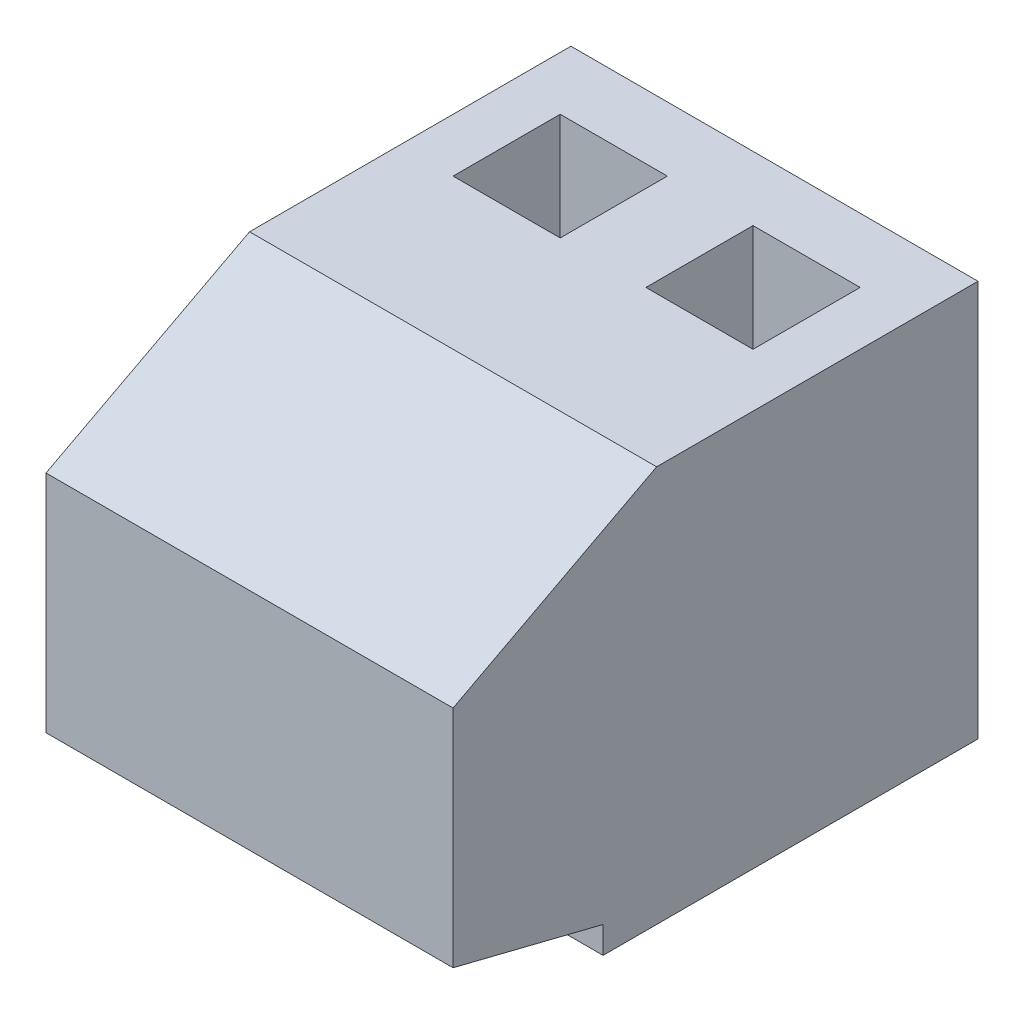
ISO-10303-21;
HEADER;
FILE_DESCRIPTION(('STEP AP214'),'2;1');
FILE_NAME('part.step','',(''),(''),'','','');
FILE_SCHEMA(('AUTOMOTIVE_DESIGN { 1 0 10303 214 1 1 1 1 }'));
ENDSEC;
DATA;
#1=APPLICATION_CONTEXT('core data for automotive mechanical design processes');
#2=APPLICATION_PROTOCOL_DEFINITION('international standard','automotive_design',2000,#1);
#3=PRODUCT_CONTEXT('',#1,'mechanical');
#4=PRODUCT('Part','Part','',(#3));
#5=PRODUCT_RELATED_PRODUCT_CATEGORY('part','',(#4));
#6=PRODUCT_DEFINITION_FORMATION('','',#4);
#7=PRODUCT_DEFINITION_CONTEXT('part definition',#1,'design');
#8=PRODUCT_DEFINITION('design','',#6,#7);
#9=PRODUCT_DEFINITION_SHAPE('','',#8);
#10=(LENGTH_UNIT() NAMED_UNIT(*) SI_UNIT(.MILLI.,.METRE.));
#11=(NAMED_UNIT(*) PLANE_ANGLE_UNIT() SI_UNIT($,.RADIAN.));
#12=(NAMED_UNIT(*) SI_UNIT($,.STERADIAN.) SOLID_ANGLE_UNIT());
#13=UNCERTAINTY_MEASURE_WITH_UNIT(LENGTH_MEASURE(1.E-05),#10,'distance_accuracy_value','');
#14=(GEOMETRIC_REPRESENTATION_CONTEXT(3) GLOBAL_UNCERTAINTY_ASSIGNED_CONTEXT((#13)) GLOBAL_UNIT_ASSIGNED_CONTEXT((#10,
#11,#12)) REPRESENTATION_CONTEXT('',''));
#15=CARTESIAN_POINT('',(0.,0.,0.));
#16=DIRECTION('',(0.,0.,1.));
#17=DIRECTION('',(1.,0.,0.));
#18=AXIS2_PLACEMENT_3D('',#15,#16,#17);
#19=CARTESIAN_POINT('',(3.8,3.7,6.));
#20=DIRECTION('',(-1.,0.,0.));
#21=DIRECTION('',(0.,-1.,0.));
#22=AXIS2_PLACEMENT_3D('',#19,#20,#21);
#23=PLANE('',#22);
#24=DIRECTION('',(0.,1.,0.));
#25=VECTOR('',#24,1.);
#26=CARTESIAN_POINT('',(3.8,3.7,0.));
#27=LINE('',#26,#25);
#28=CARTESIAN_POINT('',(3.8,-3.7,0.));
#29=VERTEX_POINT('',#28);
#30=CARTESIAN_POINT('',(3.8,3.7,0.));
#31=VERTEX_POINT('',#30);
#32=EDGE_CURVE('E237',#29,#31,#27,.T.);
#33=ORIENTED_EDGE('',*,*,#32,.T.);
#34=DIRECTION('',(0.,0.,-1.));
#35=VECTOR('',#34,1.);
#36=CARTESIAN_POINT('',(3.8,3.7,6.));
#37=LINE('',#36,#35);
#38=CARTESIAN_POINT('',(3.8,3.7,6.));
#39=VERTEX_POINT('',#38);
#40=EDGE_CURVE('E11',#39,#31,#37,.T.);
#41=ORIENTED_EDGE('',*,*,#40,.F.);
#42=DIRECTION('',(0.,-0.465746432832622,0.884918222381982));
#43=VECTOR('',#42,1.);
#44=CARTESIAN_POINT('',(3.8,1.7,9.8));
#45=LINE('',#44,#43);
#46=CARTESIAN_POINT('',(3.8,1.7,9.8));
#47=VERTEX_POINT('',#46);
#48=EDGE_CURVE('E202',#39,#47,#45,.T.);
#49=ORIENTED_EDGE('',*,*,#48,.T.);
#50=DIRECTION('',(0.,-1.,0.));
#51=VECTOR('',#50,1.);
#52=CARTESIAN_POINT('',(3.8,-2.5,9.8));
#53=LINE('',#52,#51);
#54=CARTESIAN_POINT('',(3.8,-2.5,9.8));
#55=VERTEX_POINT('',#54);
#56=EDGE_CURVE('E219',#47,#55,#53,.T.);
#57=ORIENTED_EDGE('',*,*,#56,.T.);
#58=DIRECTION('',(0.,-0.242535625036333,-0.970142500145332));
#59=VECTOR('',#58,1.);
#60=CARTESIAN_POINT('',(3.8,-3.2,7.));
#61=LINE('',#60,#59);
#62=CARTESIAN_POINT('',(3.8,-3.2,7.));
#63=VERTEX_POINT('',#62);
#64=EDGE_CURVE('E222',#55,#63,#61,.T.);
#65=ORIENTED_EDGE('',*,*,#64,.T.);
#66=DIRECTION('',(0.,-1.,0.));
#67=VECTOR('',#66,1.);
#68=CARTESIAN_POINT('',(3.8,-3.7,7.));
#69=LINE('',#68,#67);
#70=CARTESIAN_POINT('',(3.8,-3.7,7.));
#71=VERTEX_POINT('',#70);
#72=EDGE_CURVE('E225',#63,#71,#69,.T.);
#73=ORIENTED_EDGE('',*,*,#72,.T.);
#74=DIRECTION('',(0.,0.,-1.));
#75=VECTOR('',#74,1.);
#76=CARTESIAN_POINT('',(3.8,-3.7,6.));
#77=LINE('',#76,#75);
#78=EDGE_CURVE('E241',#71,#29,#77,.T.);
#79=ORIENTED_EDGE('',*,*,#78,.T.);
#80=EDGE_LOOP('',(#33,#41,#49,#57,#65,#73,#79));
#81=FACE_BOUND('',#80,.T.);
#82=ADVANCED_FACE('F33',(#81),#23,.F.);
#83=CARTESIAN_POINT('',(-3.8,3.7,6.));
#84=DIRECTION('',(0.,-1.,0.));
#85=DIRECTION('',(0.,0.,-1.));
#86=AXIS2_PLACEMENT_3D('',#83,#84,#85);
#87=PLANE('',#86);
#88=DIRECTION('',(-1.,0.,0.));
#89=VECTOR('',#88,1.);
#90=CARTESIAN_POINT('',(2.8,3.7,1.2));
#91=LINE('',#90,#89);
#92=CARTESIAN_POINT('',(2.8,3.7,1.2));
#93=VERTEX_POINT('',#92);
#94=CARTESIAN_POINT('',(0.8,3.7,1.2));
#95=VERTEX_POINT('',#94);
#96=EDGE_CURVE('E168',#93,#95,#91,.T.);
#97=ORIENTED_EDGE('',*,*,#96,.F.);
#98=DIRECTION('',(0.,0.,-1.));
#99=VECTOR('',#98,1.);
#100=CARTESIAN_POINT('',(2.8,3.7,1.2));
#101=LINE('',#100,#99);
#102=CARTESIAN_POINT('',(2.8,3.7,3.2));
#103=VERTEX_POINT('',#102);
#104=EDGE_CURVE('E47',#103,#93,#101,.T.);
#105=ORIENTED_EDGE('',*,*,#104,.F.);
#106=DIRECTION('',(1.,0.,0.));
#107=VECTOR('',#106,1.);
#108=CARTESIAN_POINT('',(2.8,3.7,3.2));
#109=LINE('',#108,#107);
#110=CARTESIAN_POINT('',(0.8,3.7,3.2));
#111=VERTEX_POINT('',#110);
#112=EDGE_CURVE('E159',#111,#103,#109,.T.);
#113=ORIENTED_EDGE('',*,*,#112,.F.);
#114=DIRECTION('',(0.,0.,1.));
#115=VECTOR('',#114,1.);
#116=CARTESIAN_POINT('',(0.8,3.7,1.2));
#117=LINE('',#116,#115);
#118=EDGE_CURVE('E162',#95,#111,#117,.T.);
#119=ORIENTED_EDGE('',*,*,#118,.F.);
#120=EDGE_LOOP('',(#97,#105,#113,#119));
#121=FACE_BOUND('',#120,.T.);
#122=DIRECTION('',(-1.,0.,0.));
#123=VECTOR('',#122,1.);
#124=CARTESIAN_POINT('',(-2.8,3.7,1.2));
#125=LINE('',#124,#123);
#126=CARTESIAN_POINT('',(-0.799999999999999,3.7,1.2));
#127=VERTEX_POINT('',#126);
#128=CARTESIAN_POINT('',(-2.8,3.7,1.2));
#129=VERTEX_POINT('',#128);
#130=EDGE_CURVE('E192',#127,#129,#125,.T.);
#131=ORIENTED_EDGE('',*,*,#130,.F.);
#132=DIRECTION('',(0.,0.,-1.));
#133=VECTOR('',#132,1.);
#134=CARTESIAN_POINT('',(-0.799999999999999,3.7,1.2));
#135=LINE('',#134,#133);
#136=CARTESIAN_POINT('',(-0.799999999999999,3.7,3.2));
#137=VERTEX_POINT('',#136);
#138=EDGE_CURVE('E55',#137,#127,#135,.T.);
#139=ORIENTED_EDGE('',*,*,#138,.F.);
#140=DIRECTION('',(1.,0.,0.));
#141=VECTOR('',#140,1.);
#142=CARTESIAN_POINT('',(-2.8,3.7,3.2));
#143=LINE('',#142,#141);
#144=CARTESIAN_POINT('',(-2.8,3.7,3.2));
#145=VERTEX_POINT('',#144);
#146=EDGE_CURVE('E181',#145,#137,#143,.T.);
#147=ORIENTED_EDGE('',*,*,#146,.F.);
#148=DIRECTION('',(0.,0.,1.));
#149=VECTOR('',#148,1.);
#150=CARTESIAN_POINT('',(-2.8,3.7,1.2));
#151=LINE('',#150,#149);
#152=EDGE_CURVE('E195',#129,#145,#151,.T.);
#153=ORIENTED_EDGE('',*,*,#152,.F.);
#154=EDGE_LOOP('',(#131,#139,#147,#153));
#155=FACE_BOUND('',#154,.T.);
#156=DIRECTION('',(-1.,0.,0.));
#157=VECTOR('',#156,1.);
#158=CARTESIAN_POINT('',(-3.8,3.7,0.));
#159=LINE('',#158,#157);
#160=CARTESIAN_POINT('',(-3.8,3.7,0.));
#161=VERTEX_POINT('',#160);
#162=EDGE_CURVE('E245',#31,#161,#159,.T.);
#163=ORIENTED_EDGE('',*,*,#162,.T.);
#164=DIRECTION('',(0.,0.,-1.));
#165=VECTOR('',#164,1.);
#166=CARTESIAN_POINT('',(-3.8,3.7,6.));
#167=LINE('',#166,#165);
#168=CARTESIAN_POINT('',(-3.8,3.7,6.));
#169=VERTEX_POINT('',#168);
#170=EDGE_CURVE('E40',#169,#161,#167,.T.);
#171=ORIENTED_EDGE('',*,*,#170,.F.);
#172=DIRECTION('',(-1.,0.,0.));
#173=VECTOR('',#172,1.);
#174=CARTESIAN_POINT('',(-3.8,3.7,6.));
#175=LINE('',#174,#173);
#176=EDGE_CURVE('E238',#39,#169,#175,.T.);
#177=ORIENTED_EDGE('',*,*,#176,.F.);
#178=ORIENTED_EDGE('',*,*,#40,.T.);
#179=EDGE_LOOP('',(#163,#171,#177,#178));
#180=FACE_BOUND('',#179,.T.);
#181=ADVANCED_FACE('F287',(#121,#155,#180),#87,.F.);
#182=CARTESIAN_POINT('',(-3.8,3.7,6.));
#183=DIRECTION('',(1.,0.,0.));
#184=DIRECTION('',(0.,1.,0.));
#185=AXIS2_PLACEMENT_3D('',#182,#183,#184);
#186=PLANE('',#185);
#187=DIRECTION('',(0.,-1.,0.));
#188=VECTOR('',#187,1.);
#189=CARTESIAN_POINT('',(-3.8,3.7,0.));
#190=LINE('',#189,#188);
#191=CARTESIAN_POINT('',(-3.8,-3.7,0.));
#192=VERTEX_POINT('',#191);
#193=EDGE_CURVE('E247',#161,#192,#190,.T.);
#194=ORIENTED_EDGE('',*,*,#193,.T.);
#195=DIRECTION('',(0.,0.,-1.));
#196=VECTOR('',#195,1.);
#197=CARTESIAN_POINT('',(-3.8,-3.7,6.));
#198=LINE('',#197,#196);
#199=CARTESIAN_POINT('',(-3.8,-3.7,7.));
#200=VERTEX_POINT('',#199);
#201=EDGE_CURVE('E252',#200,#192,#198,.T.);
#202=ORIENTED_EDGE('',*,*,#201,.F.);
#203=DIRECTION('',(0.,1.,0.));
#204=VECTOR('',#203,1.);
#205=CARTESIAN_POINT('',(-3.8,-3.7,7.));
#206=LINE('',#205,#204);
#207=CARTESIAN_POINT('',(-3.8,-3.2,7.));
#208=VERTEX_POINT('',#207);
#209=EDGE_CURVE('E210',#200,#208,#206,.T.);
#210=ORIENTED_EDGE('',*,*,#209,.T.);
#211=DIRECTION('',(0.,0.242535625036333,0.970142500145332));
#212=VECTOR('',#211,1.);
#213=CARTESIAN_POINT('',(-3.8,-3.2,7.));
#214=LINE('',#213,#212);
#215=CARTESIAN_POINT('',(-3.8,-2.5,9.8));
#216=VERTEX_POINT('',#215);
#217=EDGE_CURVE('E208',#208,#216,#214,.T.);
#218=ORIENTED_EDGE('',*,*,#217,.T.);
#219=DIRECTION('',(0.,1.,0.));
#220=VECTOR('',#219,1.);
#221=CARTESIAN_POINT('',(-3.8,-2.5,9.8));
#222=LINE('',#221,#220);
#223=CARTESIAN_POINT('',(-3.8,1.7,9.8));
#224=VERTEX_POINT('',#223);
#225=EDGE_CURVE('E216',#216,#224,#222,.T.);
#226=ORIENTED_EDGE('',*,*,#225,.T.);
#227=DIRECTION('',(0.,0.465746432832622,-0.884918222381982));
#228=VECTOR('',#227,1.);
#229=CARTESIAN_POINT('',(-3.8,1.7,9.8));
#230=LINE('',#229,#228);
#231=EDGE_CURVE('E213',#224,#169,#230,.T.);
#232=ORIENTED_EDGE('',*,*,#231,.T.);
#233=ORIENTED_EDGE('',*,*,#170,.T.);
#234=EDGE_LOOP('',(#194,#202,#210,#218,#226,#232,#233));
#235=FACE_BOUND('',#234,.T.);
#236=ADVANCED_FACE('F257',(#235),#186,.F.);
#237=CARTESIAN_POINT('',(-3.8,-3.7,6.));
#238=DIRECTION('',(0.,1.,0.));
#239=DIRECTION('',(0.,0.,1.));
#240=AXIS2_PLACEMENT_3D('',#237,#238,#239);
#241=PLANE('',#240);
#242=DIRECTION('',(1.,0.,0.));
#243=VECTOR('',#242,1.);
#244=CARTESIAN_POINT('',(-3.8,-3.7,0.));
#245=LINE('',#244,#243);
#246=EDGE_CURVE('E242',#192,#29,#245,.T.);
#247=ORIENTED_EDGE('',*,*,#246,.T.);
#248=ORIENTED_EDGE('',*,*,#78,.F.);
#249=DIRECTION('',(1.,0.,0.));
#250=VECTOR('',#249,1.);
#251=CARTESIAN_POINT('',(-12.1186537372342,-3.7,7.));
#252=LINE('',#251,#250);
#253=EDGE_CURVE('E211',#200,#71,#252,.T.);
#254=ORIENTED_EDGE('',*,*,#253,.F.);
#255=ORIENTED_EDGE('',*,*,#201,.T.);
#256=EDGE_LOOP('',(#247,#248,#254,#255));
#257=FACE_BOUND('',#256,.T.);
#258=ADVANCED_FACE('F265',(#257),#241,.F.);
#259=CARTESIAN_POINT('',(0.,0.,0.));
#260=DIRECTION('',(0.,0.,1.));
#261=DIRECTION('',(1.,0.,0.));
#262=AXIS2_PLACEMENT_3D('',#259,#260,#261);
#263=PLANE('',#262);
#264=ORIENTED_EDGE('',*,*,#32,.F.);
#265=ORIENTED_EDGE('',*,*,#246,.F.);
#266=ORIENTED_EDGE('',*,*,#193,.F.);
#267=ORIENTED_EDGE('',*,*,#162,.F.);
#268=EDGE_LOOP('',(#264,#265,#266,#267));
#269=FACE_BOUND('',#268,.T.);
#270=ADVANCED_FACE('F263',(#269),#263,.F.);
#271=CARTESIAN_POINT('',(-12.1186537372342,1.7,9.8));
#272=DIRECTION('',(0.,0.884918222381982,0.465746432832622));
#273=DIRECTION('',(0.,-0.465746432832622,0.884918222381982));
#274=AXIS2_PLACEMENT_3D('',#271,#272,#273);
#275=PLANE('',#274);
#276=ORIENTED_EDGE('',*,*,#231,.F.);
#277=DIRECTION('',(1.,0.,0.));
#278=VECTOR('',#277,1.);
#279=CARTESIAN_POINT('',(-12.1186537372342,1.7,9.8));
#280=LINE('',#279,#278);
#281=EDGE_CURVE('E228',#224,#47,#280,.T.);
#282=ORIENTED_EDGE('',*,*,#281,.T.);
#283=ORIENTED_EDGE('',*,*,#48,.F.);
#284=ORIENTED_EDGE('',*,*,#176,.T.);
#285=EDGE_LOOP('',(#276,#282,#283,#284));
#286=FACE_BOUND('',#285,.T.);
#287=ADVANCED_FACE('F285',(#286),#275,.T.);
#288=CARTESIAN_POINT('',(-12.1186537372342,-3.7,7.));
#289=DIRECTION('',(0.,0.,1.));
#290=DIRECTION('',(1.,0.,0.));
#291=AXIS2_PLACEMENT_3D('',#288,#289,#290);
#292=PLANE('',#291);
#293=ORIENTED_EDGE('',*,*,#209,.F.);
#294=ORIENTED_EDGE('',*,*,#253,.T.);
#295=ORIENTED_EDGE('',*,*,#72,.F.);
#296=DIRECTION('',(1.,0.,0.));
#297=VECTOR('',#296,1.);
#298=CARTESIAN_POINT('',(-12.1186537372342,-3.2,7.));
#299=LINE('',#298,#297);
#300=EDGE_CURVE('E231',#208,#63,#299,.T.);
#301=ORIENTED_EDGE('',*,*,#300,.F.);
#302=EDGE_LOOP('',(#293,#294,#295,#301));
#303=FACE_BOUND('',#302,.T.);
#304=ADVANCED_FACE('F274',(#303),#292,.T.);
#305=CARTESIAN_POINT('',(-12.1186537372342,-3.2,7.));
#306=DIRECTION('',(0.,-0.970142500145332,0.242535625036333));
#307=DIRECTION('',(0.,-0.242535625036333,-0.970142500145332));
#308=AXIS2_PLACEMENT_3D('',#305,#306,#307);
#309=PLANE('',#308);
#310=ORIENTED_EDGE('',*,*,#217,.F.);
#311=ORIENTED_EDGE('',*,*,#300,.T.);
#312=ORIENTED_EDGE('',*,*,#64,.F.);
#313=DIRECTION('',(1.,0.,0.));
#314=VECTOR('',#313,1.);
#315=CARTESIAN_POINT('',(-12.1186537372342,-2.5,9.8));
#316=LINE('',#315,#314);
#317=EDGE_CURVE('E233',#216,#55,#316,.T.);
#318=ORIENTED_EDGE('',*,*,#317,.F.);
#319=EDGE_LOOP('',(#310,#311,#312,#318));
#320=FACE_BOUND('',#319,.T.);
#321=ADVANCED_FACE('F278',(#320),#309,.T.);
#322=CARTESIAN_POINT('',(-12.1186537372342,-2.5,9.8));
#323=DIRECTION('',(0.,0.,1.));
#324=DIRECTION('',(1.,0.,0.));
#325=AXIS2_PLACEMENT_3D('',#322,#323,#324);
#326=PLANE('',#325);
#327=ORIENTED_EDGE('',*,*,#225,.F.);
#328=ORIENTED_EDGE('',*,*,#317,.T.);
#329=ORIENTED_EDGE('',*,*,#56,.F.);
#330=ORIENTED_EDGE('',*,*,#281,.F.);
#331=EDGE_LOOP('',(#327,#328,#329,#330));
#332=FACE_BOUND('',#331,.T.);
#333=ADVANCED_FACE('F283',(#332),#326,.T.);
#334=CARTESIAN_POINT('',(-0.799999999999999,-2.3,1.2));
#335=DIRECTION('',(1.,0.,0.));
#336=DIRECTION('',(0.,0.,-1.));
#337=AXIS2_PLACEMENT_3D('',#334,#335,#336);
#338=PLANE('',#337);
#339=ORIENTED_EDGE('',*,*,#138,.T.);
#340=DIRECTION('',(0.,1.,0.));
#341=VECTOR('',#340,1.);
#342=CARTESIAN_POINT('',(-0.799999999999999,-2.3,1.2));
#343=LINE('',#342,#341);
#344=CARTESIAN_POINT('',(-0.799999999999999,-2.3,1.2));
#345=VERTEX_POINT('',#344);
#346=EDGE_CURVE('E190',#345,#127,#343,.T.);
#347=ORIENTED_EDGE('',*,*,#346,.F.);
#348=DIRECTION('',(0.,0.,-1.));
#349=VECTOR('',#348,1.);
#350=CARTESIAN_POINT('',(-0.799999999999999,-2.3,1.2));
#351=LINE('',#350,#349);
#352=CARTESIAN_POINT('',(-0.799999999999999,-2.3,3.2));
#353=VERTEX_POINT('',#352);
#354=EDGE_CURVE('E177',#353,#345,#351,.T.);
#355=ORIENTED_EDGE('',*,*,#354,.F.);
#356=DIRECTION('',(0.,1.,0.));
#357=VECTOR('',#356,1.);
#358=CARTESIAN_POINT('',(-0.799999999999999,-2.3,3.2));
#359=LINE('',#358,#357);
#360=EDGE_CURVE('E200',#353,#137,#359,.T.);
#361=ORIENTED_EDGE('',*,*,#360,.T.);
#362=EDGE_LOOP('',(#339,#347,#355,#361));
#363=FACE_BOUND('',#362,.T.);
#364=ADVANCED_FACE('F305',(#363),#338,.F.);
#365=CARTESIAN_POINT('',(-2.8,-2.3,3.2));
#366=DIRECTION('',(0.,0.,1.));
#367=DIRECTION('',(1.,0.,0.));
#368=AXIS2_PLACEMENT_3D('',#365,#366,#367);
#369=PLANE('',#368);
#370=ORIENTED_EDGE('',*,*,#146,.T.);
#371=ORIENTED_EDGE('',*,*,#360,.F.);
#372=DIRECTION('',(1.,0.,0.));
#373=VECTOR('',#372,1.);
#374=CARTESIAN_POINT('',(-2.8,-2.3,3.2));
#375=LINE('',#374,#373);
#376=CARTESIAN_POINT('',(-2.8,-2.3,3.2));
#377=VERTEX_POINT('',#376);
#378=EDGE_CURVE('E187',#377,#353,#375,.T.);
#379=ORIENTED_EDGE('',*,*,#378,.F.);
#380=DIRECTION('',(0.,1.,0.));
#381=VECTOR('',#380,1.);
#382=CARTESIAN_POINT('',(-2.8,-2.3,3.2));
#383=LINE('',#382,#381);
#384=EDGE_CURVE('E203',#377,#145,#383,.T.);
#385=ORIENTED_EDGE('',*,*,#384,.T.);
#386=EDGE_LOOP('',(#370,#371,#379,#385));
#387=FACE_BOUND('',#386,.T.);
#388=ADVANCED_FACE('F312',(#387),#369,.F.);
#389=CARTESIAN_POINT('',(-2.8,-2.3,1.2));
#390=DIRECTION('',(-1.,0.,0.));
#391=DIRECTION('',(0.,0.,1.));
#392=AXIS2_PLACEMENT_3D('',#389,#390,#391);
#393=PLANE('',#392);
#394=ORIENTED_EDGE('',*,*,#152,.T.);
#395=ORIENTED_EDGE('',*,*,#384,.F.);
#396=DIRECTION('',(0.,0.,1.));
#397=VECTOR('',#396,1.);
#398=CARTESIAN_POINT('',(-2.8,-2.3,1.2));
#399=LINE('',#398,#397);
#400=CARTESIAN_POINT('',(-2.8,-2.3,1.2));
#401=VERTEX_POINT('',#400);
#402=EDGE_CURVE('E184',#401,#377,#399,.T.);
#403=ORIENTED_EDGE('',*,*,#402,.F.);
#404=DIRECTION('',(0.,1.,0.));
#405=VECTOR('',#404,1.);
#406=CARTESIAN_POINT('',(-2.8,-2.3,1.2));
#407=LINE('',#406,#405);
#408=EDGE_CURVE('E205',#401,#129,#407,.T.);
#409=ORIENTED_EDGE('',*,*,#408,.T.);
#410=EDGE_LOOP('',(#394,#395,#403,#409));
#411=FACE_BOUND('',#410,.T.);
#412=ADVANCED_FACE('F317',(#411),#393,.F.);
#413=CARTESIAN_POINT('',(-2.8,-2.3,1.2));
#414=DIRECTION('',(0.,0.,-1.));
#415=DIRECTION('',(-1.,0.,0.));
#416=AXIS2_PLACEMENT_3D('',#413,#414,#415);
#417=PLANE('',#416);
#418=ORIENTED_EDGE('',*,*,#130,.T.);
#419=ORIENTED_EDGE('',*,*,#408,.F.);
#420=DIRECTION('',(-1.,0.,0.));
#421=VECTOR('',#420,1.);
#422=CARTESIAN_POINT('',(-2.8,-2.3,1.2));
#423=LINE('',#422,#421);
#424=EDGE_CURVE('E180',#345,#401,#423,.T.);
#425=ORIENTED_EDGE('',*,*,#424,.F.);
#426=ORIENTED_EDGE('',*,*,#346,.T.);
#427=EDGE_LOOP('',(#418,#419,#425,#426));
#428=FACE_BOUND('',#427,.T.);
#429=ADVANCED_FACE('F313',(#428),#417,.F.);
#430=CARTESIAN_POINT('',(0.,-2.3,0.));
#431=DIRECTION('',(0.,1.,0.));
#432=DIRECTION('',(0.,0.,1.));
#433=AXIS2_PLACEMENT_3D('',#430,#431,#432);
#434=PLANE('',#433);
#435=ORIENTED_EDGE('',*,*,#354,.T.);
#436=ORIENTED_EDGE('',*,*,#424,.T.);
#437=ORIENTED_EDGE('',*,*,#402,.T.);
#438=ORIENTED_EDGE('',*,*,#378,.T.);
#439=EDGE_LOOP('',(#435,#436,#437,#438));
#440=FACE_BOUND('',#439,.T.);
#441=ADVANCED_FACE('F316',(#440),#434,.T.);
#442=CARTESIAN_POINT('',(2.8,-2.3,1.2));
#443=DIRECTION('',(1.,0.,0.));
#444=DIRECTION('',(0.,0.,-1.));
#445=AXIS2_PLACEMENT_3D('',#442,#443,#444);
#446=PLANE('',#445);
#447=ORIENTED_EDGE('',*,*,#104,.T.);
#448=DIRECTION('',(0.,1.,0.));
#449=VECTOR('',#448,1.);
#450=CARTESIAN_POINT('',(2.8,-2.3,1.2));
#451=LINE('',#450,#449);
#452=CARTESIAN_POINT('',(2.8,-2.3,1.2));
#453=VERTEX_POINT('',#452);
#454=EDGE_CURVE('E137',#453,#93,#451,.T.);
#455=ORIENTED_EDGE('',*,*,#454,.F.);
#456=DIRECTION('',(0.,0.,-1.));
#457=VECTOR('',#456,1.);
#458=CARTESIAN_POINT('',(2.8,-2.3,1.2));
#459=LINE('',#458,#457);
#460=CARTESIAN_POINT('',(2.8,-2.3,3.2));
#461=VERTEX_POINT('',#460);
#462=EDGE_CURVE('E141',#461,#453,#459,.T.);
#463=ORIENTED_EDGE('',*,*,#462,.F.);
#464=DIRECTION('',(0.,1.,0.));
#465=VECTOR('',#464,1.);
#466=CARTESIAN_POINT('',(2.8,-2.3,3.2));
#467=LINE('',#466,#465);
#468=EDGE_CURVE('E172',#461,#103,#467,.T.);
#469=ORIENTED_EDGE('',*,*,#468,.T.);
#470=EDGE_LOOP('',(#447,#455,#463,#469));
#471=FACE_BOUND('',#470,.T.);
#472=ADVANCED_FACE('F139',(#471),#446,.F.);
#473=CARTESIAN_POINT('',(2.8,-2.3,3.2));
#474=DIRECTION('',(0.,0.,1.));
#475=DIRECTION('',(1.,0.,0.));
#476=AXIS2_PLACEMENT_3D('',#473,#474,#475);
#477=PLANE('',#476);
#478=ORIENTED_EDGE('',*,*,#112,.T.);
#479=ORIENTED_EDGE('',*,*,#468,.F.);
#480=DIRECTION('',(1.,0.,0.));
#481=VECTOR('',#480,1.);
#482=CARTESIAN_POINT('',(2.8,-2.3,3.2));
#483=LINE('',#482,#481);
#484=CARTESIAN_POINT('',(0.8,-2.3,3.2));
#485=VERTEX_POINT('',#484);
#486=EDGE_CURVE('E147',#485,#461,#483,.T.);
#487=ORIENTED_EDGE('',*,*,#486,.F.);
#488=DIRECTION('',(0.,1.,0.));
#489=VECTOR('',#488,1.);
#490=CARTESIAN_POINT('',(0.8,-2.3,3.2));
#491=LINE('',#490,#489);
#492=EDGE_CURVE('E174',#485,#111,#491,.T.);
#493=ORIENTED_EDGE('',*,*,#492,.T.);
#494=EDGE_LOOP('',(#478,#479,#487,#493));
#495=FACE_BOUND('',#494,.T.);
#496=ADVANCED_FACE('F330',(#495),#477,.F.);
#497=CARTESIAN_POINT('',(0.8,-2.3,1.2));
#498=DIRECTION('',(-1.,0.,0.));
#499=DIRECTION('',(0.,0.,1.));
#500=AXIS2_PLACEMENT_3D('',#497,#498,#499);
#501=PLANE('',#500);
#502=ORIENTED_EDGE('',*,*,#118,.T.);
#503=ORIENTED_EDGE('',*,*,#492,.F.);
#504=DIRECTION('',(0.,0.,1.));
#505=VECTOR('',#504,1.);
#506=CARTESIAN_POINT('',(0.8,-2.3,1.2));
#507=LINE('',#506,#505);
#508=CARTESIAN_POINT('',(0.8,-2.3,1.2));
#509=VERTEX_POINT('',#508);
#510=EDGE_CURVE('E155',#509,#485,#507,.T.);
#511=ORIENTED_EDGE('',*,*,#510,.F.);
#512=DIRECTION('',(0.,1.,0.));
#513=VECTOR('',#512,1.);
#514=CARTESIAN_POINT('',(0.8,-2.3,1.2));
#515=LINE('',#514,#513);
#516=EDGE_CURVE('E146',#509,#95,#515,.T.);
#517=ORIENTED_EDGE('',*,*,#516,.T.);
#518=EDGE_LOOP('',(#502,#503,#511,#517));
#519=FACE_BOUND('',#518,.T.);
#520=ADVANCED_FACE('F333',(#519),#501,.F.);
#521=CARTESIAN_POINT('',(2.8,-2.3,1.2));
#522=DIRECTION('',(0.,0.,-1.));
#523=DIRECTION('',(-1.,0.,0.));
#524=AXIS2_PLACEMENT_3D('',#521,#522,#523);
#525=PLANE('',#524);
#526=ORIENTED_EDGE('',*,*,#96,.T.);
#527=ORIENTED_EDGE('',*,*,#516,.F.);
#528=DIRECTION('',(-1.,0.,0.));
#529=VECTOR('',#528,1.);
#530=CARTESIAN_POINT('',(2.8,-2.3,1.2));
#531=LINE('',#530,#529);
#532=EDGE_CURVE('E150',#453,#509,#531,.T.);
#533=ORIENTED_EDGE('',*,*,#532,.F.);
#534=ORIENTED_EDGE('',*,*,#454,.T.);
#535=EDGE_LOOP('',(#526,#527,#533,#534));
#536=FACE_BOUND('',#535,.T.);
#537=ADVANCED_FACE('F151',(#536),#525,.F.);
#538=CARTESIAN_POINT('',(0.,-2.3,0.));
#539=DIRECTION('',(0.,-1.,0.));
#540=DIRECTION('',(0.,0.,-1.));
#541=AXIS2_PLACEMENT_3D('',#538,#539,#540);
#542=PLANE('',#541);
#543=ORIENTED_EDGE('',*,*,#462,.T.);
#544=ORIENTED_EDGE('',*,*,#532,.T.);
#545=ORIENTED_EDGE('',*,*,#510,.T.);
#546=ORIENTED_EDGE('',*,*,#486,.T.);
#547=EDGE_LOOP('',(#543,#544,#545,#546));
#548=FACE_BOUND('',#547,.T.);
#549=ADVANCED_FACE('F157',(#548),#542,.F.);
#550=CLOSED_SHELL('',(#82,#181,#236,#258,#270,#287,#304,#321,#333,#364,#388,#412,#429,#441,#472,
#496,#520,#537,#549));
#551=MANIFOLD_SOLID_BREP('B2',#550);
#552=ADVANCED_BREP_SHAPE_REPRESENTATION('',(#18,#551),#14);
#553=SHAPE_DEFINITION_REPRESENTATION(#9,#552);
ENDSEC;
END-ISO-10303-21;
